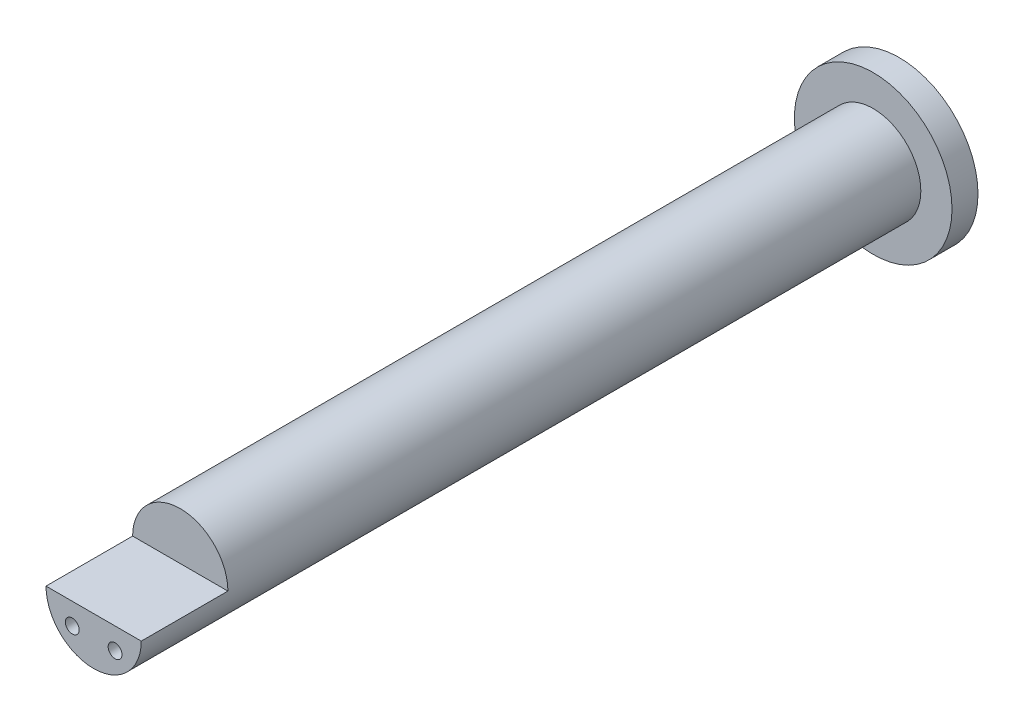
ISO-10303-21;
HEADER;
FILE_DESCRIPTION(('STEP AP214'),'2;1');
FILE_NAME('part.step','',(''),(''),'','','');
FILE_SCHEMA(('AUTOMOTIVE_DESIGN { 1 0 10303 214 1 1 1 1 }'));
ENDSEC;
DATA;
#1=APPLICATION_CONTEXT('core data for automotive mechanical design processes');
#2=APPLICATION_PROTOCOL_DEFINITION('international standard','automotive_design',2000,#1);
#3=PRODUCT_CONTEXT('',#1,'mechanical');
#4=PRODUCT('Part','Part','',(#3));
#5=PRODUCT_RELATED_PRODUCT_CATEGORY('part','',(#4));
#6=PRODUCT_DEFINITION_FORMATION('','',#4);
#7=PRODUCT_DEFINITION_CONTEXT('part definition',#1,'design');
#8=PRODUCT_DEFINITION('design','',#6,#7);
#9=PRODUCT_DEFINITION_SHAPE('','',#8);
#10=(LENGTH_UNIT() NAMED_UNIT(*) SI_UNIT(.MILLI.,.METRE.));
#11=(NAMED_UNIT(*) PLANE_ANGLE_UNIT() SI_UNIT($,.RADIAN.));
#12=(NAMED_UNIT(*) SI_UNIT($,.STERADIAN.) SOLID_ANGLE_UNIT());
#13=UNCERTAINTY_MEASURE_WITH_UNIT(LENGTH_MEASURE(1.E-05),#10,'distance_accuracy_value','');
#14=(GEOMETRIC_REPRESENTATION_CONTEXT(3) GLOBAL_UNCERTAINTY_ASSIGNED_CONTEXT((#13)) GLOBAL_UNIT_ASSIGNED_CONTEXT((#10,
#11,#12)) REPRESENTATION_CONTEXT('',''));
#15=CARTESIAN_POINT('',(0.,0.,0.));
#16=DIRECTION('',(0.,0.,1.));
#17=DIRECTION('',(1.,0.,0.));
#18=AXIS2_PLACEMENT_3D('',#15,#16,#17);
#19=CARTESIAN_POINT('',(0.,0.,3.));
#20=DIRECTION('',(0.,0.,-1.));
#21=DIRECTION('',(-1.,0.,0.));
#22=AXIS2_PLACEMENT_3D('',#19,#20,#21);
#23=CYLINDRICAL_SURFACE('',#22,9.1);
#24=CARTESIAN_POINT('',(0.,0.,3.));
#25=DIRECTION('',(0.,0.,1.));
#26=DIRECTION('',(1.,0.,0.));
#27=AXIS2_PLACEMENT_3D('',#24,#25,#26);
#28=CIRCLE('',#27,9.1);
#29=CARTESIAN_POINT('',(9.1,0.,3.));
#30=VERTEX_POINT('',#29);
#31=EDGE_CURVE('E48',#30,#30,#28,.T.);
#32=ORIENTED_EDGE('',*,*,#31,.F.);
#33=EDGE_LOOP('',(#32));
#34=FACE_BOUND('',#33,.T.);
#35=CARTESIAN_POINT('',(0.,0.,0.));
#36=DIRECTION('',(0.,0.,1.));
#37=DIRECTION('',(1.,0.,0.));
#38=AXIS2_PLACEMENT_3D('',#35,#36,#37);
#39=CIRCLE('',#38,9.1);
#40=CARTESIAN_POINT('',(9.1,0.,0.));
#41=VERTEX_POINT('',#40);
#42=EDGE_CURVE('E43',#41,#41,#39,.T.);
#43=ORIENTED_EDGE('',*,*,#42,.T.);
#44=EDGE_LOOP('',(#43));
#45=FACE_BOUND('',#44,.T.);
#46=ADVANCED_FACE('F40',(#34,#45),#23,.T.);
#47=CARTESIAN_POINT('',(0.,0.,3.));
#48=DIRECTION('',(0.,0.,1.));
#49=DIRECTION('',(1.,0.,0.));
#50=AXIS2_PLACEMENT_3D('',#47,#48,#49);
#51=PLANE('',#50);
#52=CARTESIAN_POINT('',(0.,0.,3.));
#53=DIRECTION('',(0.,0.,1.));
#54=DIRECTION('',(1.,0.,0.));
#55=AXIS2_PLACEMENT_3D('',#52,#53,#54);
#56=CIRCLE('',#55,5.5);
#57=CARTESIAN_POINT('',(5.5,0.,3.));
#58=VERTEX_POINT('',#57);
#59=EDGE_CURVE('E11',#58,#58,#56,.T.);
#60=ORIENTED_EDGE('',*,*,#59,.F.);
#61=EDGE_LOOP('',(#60));
#62=FACE_BOUND('',#61,.T.);
#63=ORIENTED_EDGE('',*,*,#31,.T.);
#64=EDGE_LOOP('',(#63));
#65=FACE_BOUND('',#64,.T.);
#66=ADVANCED_FACE('F117',(#62,#65),#51,.T.);
#67=CARTESIAN_POINT('',(0.,0.,0.));
#68=DIRECTION('',(0.,0.,1.));
#69=DIRECTION('',(1.,0.,0.));
#70=AXIS2_PLACEMENT_3D('',#67,#68,#69);
#71=PLANE('',#70);
#72=ORIENTED_EDGE('',*,*,#42,.F.);
#73=EDGE_LOOP('',(#72));
#74=FACE_BOUND('',#73,.T.);
#75=ADVANCED_FACE('F114',(#74),#71,.F.);
#76=CARTESIAN_POINT('',(0.,0.,83.));
#77=DIRECTION('',(0.,0.,-1.));
#78=DIRECTION('',(-1.,0.,0.));
#79=AXIS2_PLACEMENT_3D('',#76,#77,#78);
#80=CYLINDRICAL_SURFACE('',#79,5.5);
#81=CARTESIAN_POINT('',(0.,0.,83.));
#82=DIRECTION('',(0.,0.,1.));
#83=DIRECTION('',(1.,0.,0.));
#84=AXIS2_PLACEMENT_3D('',#81,#82,#83);
#85=CIRCLE('',#84,5.5);
#86=CARTESIAN_POINT('',(5.5,0.,83.));
#87=VERTEX_POINT('',#86);
#88=CARTESIAN_POINT('',(-5.5,0.,83.));
#89=VERTEX_POINT('',#88);
#90=EDGE_CURVE('E69',#87,#89,#85,.T.);
#91=ORIENTED_EDGE('',*,*,#90,.F.);
#92=DIRECTION('',(0.,0.,-1.));
#93=VECTOR('',#92,1.);
#94=CARTESIAN_POINT('',(5.5,0.,93.));
#95=LINE('',#94,#93);
#96=CARTESIAN_POINT('',(5.5,0.,93.));
#97=VERTEX_POINT('',#96);
#98=EDGE_CURVE('E104',#97,#87,#95,.T.);
#99=ORIENTED_EDGE('',*,*,#98,.F.);
#100=CARTESIAN_POINT('',(0.,0.,93.));
#101=DIRECTION('',(0.,0.,1.));
#102=DIRECTION('',(1.,0.,0.));
#103=AXIS2_PLACEMENT_3D('',#100,#101,#102);
#104=CIRCLE('',#103,5.5);
#105=CARTESIAN_POINT('',(-5.5,0.,93.));
#106=VERTEX_POINT('',#105);
#107=EDGE_CURVE('E97',#106,#97,#104,.T.);
#108=ORIENTED_EDGE('',*,*,#107,.F.);
#109=DIRECTION('',(0.,0.,-1.));
#110=VECTOR('',#109,1.);
#111=CARTESIAN_POINT('',(-5.5,0.,93.));
#112=LINE('',#111,#110);
#113=EDGE_CURVE('E100',#106,#89,#112,.T.);
#114=ORIENTED_EDGE('',*,*,#113,.T.);
#115=EDGE_LOOP('',(#91,#99,#108,#114));
#116=FACE_BOUND('',#115,.T.);
#117=ORIENTED_EDGE('',*,*,#59,.T.);
#118=EDGE_LOOP('',(#117));
#119=FACE_BOUND('',#118,.T.);
#120=ADVANCED_FACE('F116',(#116,#119),#80,.T.);
#121=CARTESIAN_POINT('',(0.,0.,83.));
#122=DIRECTION('',(0.,0.,1.));
#123=DIRECTION('',(1.,0.,0.));
#124=AXIS2_PLACEMENT_3D('',#121,#122,#123);
#125=PLANE('',#124);
#126=DIRECTION('',(-1.,0.,0.));
#127=VECTOR('',#126,1.);
#128=CARTESIAN_POINT('',(-5.5,0.,83.));
#129=LINE('',#128,#127);
#130=EDGE_CURVE('E55',#87,#89,#129,.T.);
#131=ORIENTED_EDGE('',*,*,#130,.F.);
#132=ORIENTED_EDGE('',*,*,#90,.T.);
#133=EDGE_LOOP('',(#131,#132));
#134=FACE_BOUND('',#133,.T.);
#135=ADVANCED_FACE('F122',(#134),#125,.T.);
#136=CARTESIAN_POINT('',(-5.5,0.,93.));
#137=DIRECTION('',(0.,-1.,0.));
#138=DIRECTION('',(0.,0.,-1.));
#139=AXIS2_PLACEMENT_3D('',#136,#137,#138);
#140=PLANE('',#139);
#141=ORIENTED_EDGE('',*,*,#130,.T.);
#142=ORIENTED_EDGE('',*,*,#113,.F.);
#143=DIRECTION('',(-1.,0.,0.));
#144=VECTOR('',#143,1.);
#145=CARTESIAN_POINT('',(-5.5,0.,93.));
#146=LINE('',#145,#144);
#147=EDGE_CURVE('E63',#97,#106,#146,.T.);
#148=ORIENTED_EDGE('',*,*,#147,.F.);
#149=ORIENTED_EDGE('',*,*,#98,.T.);
#150=EDGE_LOOP('',(#141,#142,#148,#149));
#151=FACE_BOUND('',#150,.T.);
#152=ADVANCED_FACE('F155',(#151),#140,.F.);
#153=CARTESIAN_POINT('',(0.,0.,93.));
#154=DIRECTION('',(0.,0.,1.));
#155=DIRECTION('',(1.,0.,0.));
#156=AXIS2_PLACEMENT_3D('',#153,#154,#155);
#157=PLANE('',#156);
#158=CARTESIAN_POINT('',(-2.47487373415293,-2.4748737341529,93.));
#159=DIRECTION('',(0.,0.,1.));
#160=DIRECTION('',(1.,0.,0.));
#161=AXIS2_PLACEMENT_3D('',#158,#159,#160);
#162=CIRCLE('',#161,0.79999999999999);
#163=CARTESIAN_POINT('',(-1.67487373415294,-2.4748737341529,93.));
#164=VERTEX_POINT('',#163);
#165=EDGE_CURVE('E87',#164,#164,#162,.T.);
#166=ORIENTED_EDGE('',*,*,#165,.F.);
#167=EDGE_LOOP('',(#166));
#168=FACE_BOUND('',#167,.T.);
#169=CARTESIAN_POINT('',(2.47487373415293,-2.4748737341529,93.));
#170=DIRECTION('',(0.,0.,1.));
#171=DIRECTION('',(1.,0.,0.));
#172=AXIS2_PLACEMENT_3D('',#169,#170,#171);
#173=CIRCLE('',#172,0.79999999999999);
#174=CARTESIAN_POINT('',(3.27487373415292,-2.4748737341529,93.));
#175=VERTEX_POINT('',#174);
#176=EDGE_CURVE('E86',#175,#175,#173,.T.);
#177=ORIENTED_EDGE('',*,*,#176,.F.);
#178=EDGE_LOOP('',(#177));
#179=FACE_BOUND('',#178,.T.);
#180=ORIENTED_EDGE('',*,*,#107,.T.);
#181=ORIENTED_EDGE('',*,*,#147,.T.);
#182=EDGE_LOOP('',(#180,#181));
#183=FACE_BOUND('',#182,.T.);
#184=ADVANCED_FACE('F164',(#168,#179,#183),#157,.T.);
#185=CARTESIAN_POINT('',(2.47487373415293,-2.4748737341529,83.));
#186=DIRECTION('',(0.,0.,1.));
#187=DIRECTION('',(1.,0.,0.));
#188=AXIS2_PLACEMENT_3D('',#185,#186,#187);
#189=CONICAL_SURFACE('',#188,0.799999999999987,1.02974425867664);
#190=CARTESIAN_POINT('',(2.47487373415293,-2.4748737341529,82.519311504778));
#191=VERTEX_POINT('',#190);
#192=VERTEX_LOOP('',#191);
#193=FACE_BOUND('',#192,.T.);
#194=CARTESIAN_POINT('',(2.47487373415293,-2.4748737341529,83.));
#195=DIRECTION('',(0.,0.,1.));
#196=DIRECTION('',(1.,0.,0.));
#197=AXIS2_PLACEMENT_3D('',#194,#195,#196);
#198=CIRCLE('',#197,0.799999999999987);
#199=CARTESIAN_POINT('',(3.27487373415292,-2.4748737341529,83.));
#200=VERTEX_POINT('',#199);
#201=EDGE_CURVE('E90',#200,#200,#198,.T.);
#202=ORIENTED_EDGE('',*,*,#201,.T.);
#203=EDGE_LOOP('',(#202));
#204=FACE_BOUND('',#203,.T.);
#205=ADVANCED_FACE('F176',(#193,#204),#189,.F.);
#206=CARTESIAN_POINT('',(2.47487373415293,-2.4748737341529,93.));
#207=DIRECTION('',(0.,0.,1.));
#208=DIRECTION('',(1.,0.,0.));
#209=AXIS2_PLACEMENT_3D('',#206,#207,#208);
#210=CYLINDRICAL_SURFACE('',#209,0.799999999999989);
#211=ORIENTED_EDGE('',*,*,#201,.F.);
#212=EDGE_LOOP('',(#211));
#213=FACE_BOUND('',#212,.T.);
#214=ORIENTED_EDGE('',*,*,#176,.T.);
#215=EDGE_LOOP('',(#214));
#216=FACE_BOUND('',#215,.T.);
#217=ADVANCED_FACE('F80',(#213,#216),#210,.F.);
#218=CARTESIAN_POINT('',(-2.47487373415293,-2.4748737341529,83.));
#219=DIRECTION('',(0.,0.,1.));
#220=DIRECTION('',(1.,0.,0.));
#221=AXIS2_PLACEMENT_3D('',#218,#219,#220);
#222=CONICAL_SURFACE('',#221,0.799999999999987,1.02974425867664);
#223=CARTESIAN_POINT('',(-2.47487373415293,-2.4748737341529,82.519311504778));
#224=VERTEX_POINT('',#223);
#225=VERTEX_LOOP('',#224);
#226=FACE_BOUND('',#225,.T.);
#227=CARTESIAN_POINT('',(-2.47487373415293,-2.4748737341529,83.));
#228=DIRECTION('',(0.,0.,1.));
#229=DIRECTION('',(1.,0.,0.));
#230=AXIS2_PLACEMENT_3D('',#227,#228,#229);
#231=CIRCLE('',#230,0.799999999999987);
#232=CARTESIAN_POINT('',(-1.67487373415294,-2.4748737341529,83.));
#233=VERTEX_POINT('',#232);
#234=EDGE_CURVE('E84',#233,#233,#231,.T.);
#235=ORIENTED_EDGE('',*,*,#234,.T.);
#236=EDGE_LOOP('',(#235));
#237=FACE_BOUND('',#236,.T.);
#238=ADVANCED_FACE('F76',(#226,#237),#222,.F.);
#239=CARTESIAN_POINT('',(-2.47487373415293,-2.4748737341529,93.));
#240=DIRECTION('',(0.,0.,1.));
#241=DIRECTION('',(1.,0.,0.));
#242=AXIS2_PLACEMENT_3D('',#239,#240,#241);
#243=CYLINDRICAL_SURFACE('',#242,0.799999999999989);
#244=ORIENTED_EDGE('',*,*,#234,.F.);
#245=EDGE_LOOP('',(#244));
#246=FACE_BOUND('',#245,.T.);
#247=ORIENTED_EDGE('',*,*,#165,.T.);
#248=EDGE_LOOP('',(#247));
#249=FACE_BOUND('',#248,.T.);
#250=ADVANCED_FACE('F79',(#246,#249),#243,.F.);
#251=CLOSED_SHELL('',(#46,#66,#75,#120,#135,#152,#184,#205,#217,#238,#250));
#252=MANIFOLD_SOLID_BREP('B2',#251);
#253=ADVANCED_BREP_SHAPE_REPRESENTATION('',(#18,#252),#14);
#254=SHAPE_DEFINITION_REPRESENTATION(#9,#253);
ENDSEC;
END-ISO-10303-21;
